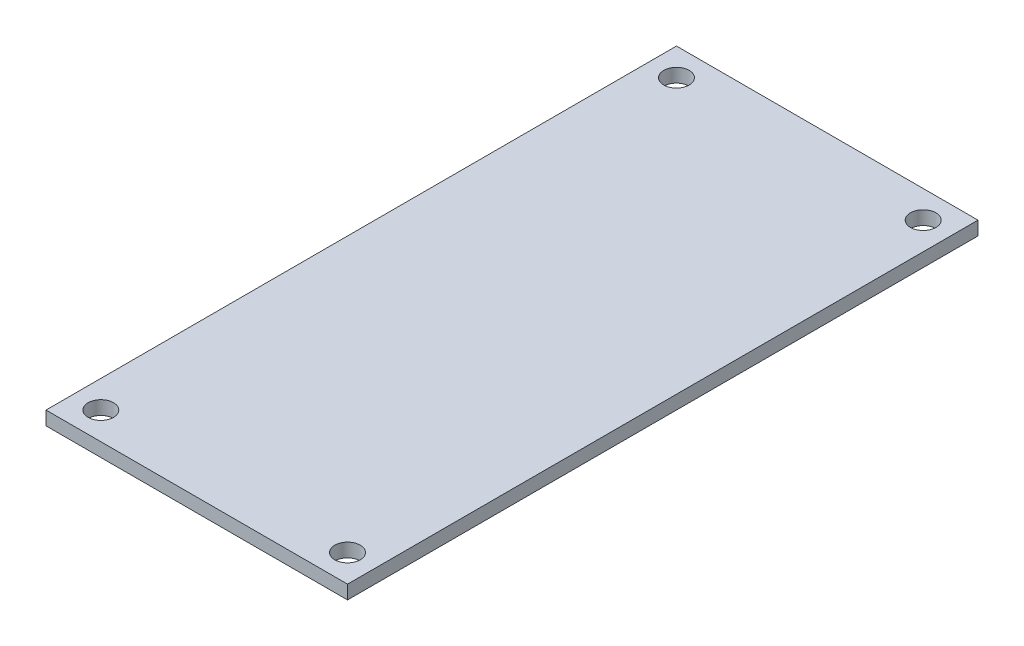
ISO-10303-21;
HEADER;
FILE_DESCRIPTION(('STEP AP214'),'2;1');
FILE_NAME('part.step','',(''),(''),'','','');
FILE_SCHEMA(('AUTOMOTIVE_DESIGN { 1 0 10303 214 1 1 1 1 }'));
ENDSEC;
DATA;
#1=APPLICATION_CONTEXT('core data for automotive mechanical design processes');
#2=APPLICATION_PROTOCOL_DEFINITION('international standard','automotive_design',2000,#1);
#3=PRODUCT_CONTEXT('',#1,'mechanical');
#4=PRODUCT('Part','Part','',(#3));
#5=PRODUCT_RELATED_PRODUCT_CATEGORY('part','',(#4));
#6=PRODUCT_DEFINITION_FORMATION('','',#4);
#7=PRODUCT_DEFINITION_CONTEXT('part definition',#1,'design');
#8=PRODUCT_DEFINITION('design','',#6,#7);
#9=PRODUCT_DEFINITION_SHAPE('','',#8);
#10=(LENGTH_UNIT() NAMED_UNIT(*) SI_UNIT(.MILLI.,.METRE.));
#11=(NAMED_UNIT(*) PLANE_ANGLE_UNIT() SI_UNIT($,.RADIAN.));
#12=(NAMED_UNIT(*) SI_UNIT($,.STERADIAN.) SOLID_ANGLE_UNIT());
#13=UNCERTAINTY_MEASURE_WITH_UNIT(LENGTH_MEASURE(1.E-05),#10,'distance_accuracy_value','');
#14=(GEOMETRIC_REPRESENTATION_CONTEXT(3) GLOBAL_UNCERTAINTY_ASSIGNED_CONTEXT((#13)) GLOBAL_UNIT_ASSIGNED_CONTEXT((#10,
#11,#12)) REPRESENTATION_CONTEXT('',''));
#15=CARTESIAN_POINT('',(0.,0.,0.));
#16=DIRECTION('',(0.,0.,1.));
#17=DIRECTION('',(1.,0.,0.));
#18=AXIS2_PLACEMENT_3D('',#15,#16,#17);
#19=CARTESIAN_POINT('',(0.,1.5875,0.));
#20=DIRECTION('',(0.,0.,-1.));
#21=DIRECTION('',(-1.,0.,0.));
#22=AXIS2_PLACEMENT_3D('',#19,#20,#21);
#23=PLANE('',#22);
#24=DIRECTION('',(1.,0.,0.));
#25=VECTOR('',#24,1.);
#26=CARTESIAN_POINT('',(0.,0.,0.));
#27=LINE('',#26,#25);
#28=CARTESIAN_POINT('',(0.,0.,0.));
#29=VERTEX_POINT('',#28);
#30=CARTESIAN_POINT('',(34.925,0.,0.));
#31=VERTEX_POINT('',#30);
#32=EDGE_CURVE('E96',#29,#31,#27,.T.);
#33=ORIENTED_EDGE('',*,*,#32,.T.);
#34=DIRECTION('',(0.,-1.,0.));
#35=VECTOR('',#34,1.);
#36=CARTESIAN_POINT('',(34.925,1.5875,0.));
#37=LINE('',#36,#35);
#38=CARTESIAN_POINT('',(34.925,1.5875,0.));
#39=VERTEX_POINT('',#38);
#40=EDGE_CURVE('E11',#39,#31,#37,.T.);
#41=ORIENTED_EDGE('',*,*,#40,.F.);
#42=DIRECTION('',(1.,0.,0.));
#43=VECTOR('',#42,1.);
#44=CARTESIAN_POINT('',(0.,1.5875,0.));
#45=LINE('',#44,#43);
#46=CARTESIAN_POINT('',(0.,1.5875,0.));
#47=VERTEX_POINT('',#46);
#48=EDGE_CURVE('E82',#47,#39,#45,.T.);
#49=ORIENTED_EDGE('',*,*,#48,.F.);
#50=DIRECTION('',(0.,-1.,0.));
#51=VECTOR('',#50,1.);
#52=CARTESIAN_POINT('',(0.,1.5875,0.));
#53=LINE('',#52,#51);
#54=EDGE_CURVE('E49',#47,#29,#53,.T.);
#55=ORIENTED_EDGE('',*,*,#54,.T.);
#56=EDGE_LOOP('',(#33,#41,#49,#55));
#57=FACE_BOUND('',#56,.T.);
#58=ADVANCED_FACE('F33',(#57),#23,.F.);
#59=CARTESIAN_POINT('',(34.925,1.5875,0.));
#60=DIRECTION('',(-1.,0.,0.));
#61=DIRECTION('',(0.,0.,1.));
#62=AXIS2_PLACEMENT_3D('',#59,#60,#61);
#63=PLANE('',#62);
#64=DIRECTION('',(0.,0.,-1.));
#65=VECTOR('',#64,1.);
#66=CARTESIAN_POINT('',(34.925,0.,0.));
#67=LINE('',#66,#65);
#68=CARTESIAN_POINT('',(34.925,0.,-73.025));
#69=VERTEX_POINT('',#68);
#70=EDGE_CURVE('E87',#31,#69,#67,.T.);
#71=ORIENTED_EDGE('',*,*,#70,.T.);
#72=DIRECTION('',(0.,-1.,0.));
#73=VECTOR('',#72,1.);
#74=CARTESIAN_POINT('',(34.925,1.5875,-73.025));
#75=LINE('',#74,#73);
#76=CARTESIAN_POINT('',(34.925,1.5875,-73.025));
#77=VERTEX_POINT('',#76);
#78=EDGE_CURVE('E41',#77,#69,#75,.T.);
#79=ORIENTED_EDGE('',*,*,#78,.F.);
#80=DIRECTION('',(0.,0.,-1.));
#81=VECTOR('',#80,1.);
#82=CARTESIAN_POINT('',(34.925,1.5875,0.));
#83=LINE('',#82,#81);
#84=EDGE_CURVE('E74',#39,#77,#83,.T.);
#85=ORIENTED_EDGE('',*,*,#84,.F.);
#86=ORIENTED_EDGE('',*,*,#40,.T.);
#87=EDGE_LOOP('',(#71,#79,#85,#86));
#88=FACE_BOUND('',#87,.T.);
#89=ADVANCED_FACE('F86',(#88),#63,.F.);
#90=CARTESIAN_POINT('',(0.,1.5875,-73.025));
#91=DIRECTION('',(0.,0.,-1.));
#92=DIRECTION('',(-1.,0.,0.));
#93=AXIS2_PLACEMENT_3D('',#90,#91,#92);
#94=PLANE('',#93);
#95=DIRECTION('',(1.,0.,0.));
#96=VECTOR('',#95,1.);
#97=CARTESIAN_POINT('',(0.,0.,-73.025));
#98=LINE('',#97,#96);
#99=CARTESIAN_POINT('',(0.,0.,-73.025));
#100=VERTEX_POINT('',#99);
#101=EDGE_CURVE('E100',#100,#69,#98,.T.);
#102=ORIENTED_EDGE('',*,*,#101,.F.);
#103=DIRECTION('',(0.,-1.,0.));
#104=VECTOR('',#103,1.);
#105=CARTESIAN_POINT('',(0.,1.5875,-73.025));
#106=LINE('',#105,#104);
#107=CARTESIAN_POINT('',(0.,1.5875,-73.025));
#108=VERTEX_POINT('',#107);
#109=EDGE_CURVE('E63',#108,#100,#106,.T.);
#110=ORIENTED_EDGE('',*,*,#109,.F.);
#111=DIRECTION('',(1.,0.,0.));
#112=VECTOR('',#111,1.);
#113=CARTESIAN_POINT('',(0.,1.5875,-73.025));
#114=LINE('',#113,#112);
#115=EDGE_CURVE('E81',#108,#77,#114,.T.);
#116=ORIENTED_EDGE('',*,*,#115,.T.);
#117=ORIENTED_EDGE('',*,*,#78,.T.);
#118=EDGE_LOOP('',(#102,#110,#116,#117));
#119=FACE_BOUND('',#118,.T.);
#120=ADVANCED_FACE('F90',(#119),#94,.T.);
#121=CARTESIAN_POINT('',(0.,1.5875,0.));
#122=DIRECTION('',(-1.,0.,0.));
#123=DIRECTION('',(0.,0.,1.));
#124=AXIS2_PLACEMENT_3D('',#121,#122,#123);
#125=PLANE('',#124);
#126=DIRECTION('',(0.,0.,-1.));
#127=VECTOR('',#126,1.);
#128=CARTESIAN_POINT('',(0.,0.,0.));
#129=LINE('',#128,#127);
#130=EDGE_CURVE('E102',#29,#100,#129,.T.);
#131=ORIENTED_EDGE('',*,*,#130,.F.);
#132=ORIENTED_EDGE('',*,*,#54,.F.);
#133=DIRECTION('',(0.,0.,-1.));
#134=VECTOR('',#133,1.);
#135=CARTESIAN_POINT('',(0.,1.5875,0.));
#136=LINE('',#135,#134);
#137=EDGE_CURVE('E91',#47,#108,#136,.T.);
#138=ORIENTED_EDGE('',*,*,#137,.T.);
#139=ORIENTED_EDGE('',*,*,#109,.T.);
#140=EDGE_LOOP('',(#131,#132,#138,#139));
#141=FACE_BOUND('',#140,.T.);
#142=ADVANCED_FACE('F138',(#141),#125,.T.);
#143=CARTESIAN_POINT('',(0.,1.5875,0.));
#144=DIRECTION('',(0.,1.,0.));
#145=DIRECTION('',(0.,0.,1.));
#146=AXIS2_PLACEMENT_3D('',#143,#144,#145);
#147=PLANE('',#146);
#148=CARTESIAN_POINT('',(3.17500000000001,1.5875,-3.175));
#149=DIRECTION('',(0.,1.,0.));
#150=DIRECTION('',(0.,0.,1.));
#151=AXIS2_PLACEMENT_3D('',#148,#149,#150);
#152=CIRCLE('',#151,1.4732);
#153=CARTESIAN_POINT('',(3.17500000000001,1.5875,-1.7018));
#154=VERTEX_POINT('',#153);
#155=EDGE_CURVE('E123',#154,#154,#152,.T.);
#156=ORIENTED_EDGE('',*,*,#155,.F.);
#157=EDGE_LOOP('',(#156));
#158=FACE_BOUND('',#157,.T.);
#159=CARTESIAN_POINT('',(31.75,1.5875,-3.175));
#160=DIRECTION('',(0.,1.,0.));
#161=DIRECTION('',(0.,0.,1.));
#162=AXIS2_PLACEMENT_3D('',#159,#160,#161);
#163=CIRCLE('',#162,1.4732);
#164=CARTESIAN_POINT('',(31.75,1.5875,-1.7018));
#165=VERTEX_POINT('',#164);
#166=EDGE_CURVE('E117',#165,#165,#163,.T.);
#167=ORIENTED_EDGE('',*,*,#166,.F.);
#168=EDGE_LOOP('',(#167));
#169=FACE_BOUND('',#168,.T.);
#170=CARTESIAN_POINT('',(3.175,1.5875,-69.85));
#171=DIRECTION('',(0.,1.,0.));
#172=DIRECTION('',(0.,0.,1.));
#173=AXIS2_PLACEMENT_3D('',#170,#171,#172);
#174=CIRCLE('',#173,1.4732);
#175=CARTESIAN_POINT('',(3.175,1.5875,-68.3768));
#176=VERTEX_POINT('',#175);
#177=EDGE_CURVE('E111',#176,#176,#174,.T.);
#178=ORIENTED_EDGE('',*,*,#177,.F.);
#179=EDGE_LOOP('',(#178));
#180=FACE_BOUND('',#179,.T.);
#181=CARTESIAN_POINT('',(31.75,1.5875,-69.85));
#182=DIRECTION('',(0.,1.,0.));
#183=DIRECTION('',(0.,0.,1.));
#184=AXIS2_PLACEMENT_3D('',#181,#182,#183);
#185=CIRCLE('',#184,1.4732);
#186=CARTESIAN_POINT('',(31.75,1.5875,-68.3768));
#187=VERTEX_POINT('',#186);
#188=EDGE_CURVE('E98',#187,#187,#185,.T.);
#189=ORIENTED_EDGE('',*,*,#188,.F.);
#190=EDGE_LOOP('',(#189));
#191=FACE_BOUND('',#190,.T.);
#192=ORIENTED_EDGE('',*,*,#48,.T.);
#193=ORIENTED_EDGE('',*,*,#84,.T.);
#194=ORIENTED_EDGE('',*,*,#115,.F.);
#195=ORIENTED_EDGE('',*,*,#137,.F.);
#196=EDGE_LOOP('',(#192,#193,#194,#195));
#197=FACE_BOUND('',#196,.T.);
#198=ADVANCED_FACE('F78',(#158,#169,#180,#191,#197),#147,.T.);
#199=CARTESIAN_POINT('',(0.,0.,0.));
#200=DIRECTION('',(0.,1.,0.));
#201=DIRECTION('',(0.,0.,1.));
#202=AXIS2_PLACEMENT_3D('',#199,#200,#201);
#203=PLANE('',#202);
#204=CARTESIAN_POINT('',(3.17500000000001,0.,-3.175));
#205=DIRECTION('',(0.,1.,0.));
#206=DIRECTION('',(0.,0.,1.));
#207=AXIS2_PLACEMENT_3D('',#204,#205,#206);
#208=CIRCLE('',#207,1.4732);
#209=CARTESIAN_POINT('',(3.17500000000001,0.,-1.7018));
#210=VERTEX_POINT('',#209);
#211=EDGE_CURVE('E126',#210,#210,#208,.T.);
#212=ORIENTED_EDGE('',*,*,#211,.T.);
#213=EDGE_LOOP('',(#212));
#214=FACE_BOUND('',#213,.T.);
#215=CARTESIAN_POINT('',(31.75,0.,-3.175));
#216=DIRECTION('',(0.,1.,0.));
#217=DIRECTION('',(0.,0.,1.));
#218=AXIS2_PLACEMENT_3D('',#215,#216,#217);
#219=CIRCLE('',#218,1.4732);
#220=CARTESIAN_POINT('',(31.75,0.,-1.7018));
#221=VERTEX_POINT('',#220);
#222=EDGE_CURVE('E120',#221,#221,#219,.T.);
#223=ORIENTED_EDGE('',*,*,#222,.T.);
#224=EDGE_LOOP('',(#223));
#225=FACE_BOUND('',#224,.T.);
#226=CARTESIAN_POINT('',(3.175,0.,-69.85));
#227=DIRECTION('',(0.,1.,0.));
#228=DIRECTION('',(0.,0.,1.));
#229=AXIS2_PLACEMENT_3D('',#226,#227,#228);
#230=CIRCLE('',#229,1.4732);
#231=CARTESIAN_POINT('',(3.175,0.,-68.3768));
#232=VERTEX_POINT('',#231);
#233=EDGE_CURVE('E114',#232,#232,#230,.T.);
#234=ORIENTED_EDGE('',*,*,#233,.T.);
#235=EDGE_LOOP('',(#234));
#236=FACE_BOUND('',#235,.T.);
#237=CARTESIAN_POINT('',(31.75,0.,-69.85));
#238=DIRECTION('',(0.,1.,0.));
#239=DIRECTION('',(0.,0.,1.));
#240=AXIS2_PLACEMENT_3D('',#237,#238,#239);
#241=CIRCLE('',#240,1.4732);
#242=CARTESIAN_POINT('',(31.75,0.,-68.3768));
#243=VERTEX_POINT('',#242);
#244=EDGE_CURVE('E108',#243,#243,#241,.T.);
#245=ORIENTED_EDGE('',*,*,#244,.T.);
#246=EDGE_LOOP('',(#245));
#247=FACE_BOUND('',#246,.T.);
#248=ORIENTED_EDGE('',*,*,#32,.F.);
#249=ORIENTED_EDGE('',*,*,#130,.T.);
#250=ORIENTED_EDGE('',*,*,#101,.T.);
#251=ORIENTED_EDGE('',*,*,#70,.F.);
#252=EDGE_LOOP('',(#248,#249,#250,#251));
#253=FACE_BOUND('',#252,.T.);
#254=ADVANCED_FACE('F137',(#214,#225,#236,#247,#253),#203,.F.);
#255=CARTESIAN_POINT('',(31.75,1.5875,-69.85));
#256=DIRECTION('',(0.,-1.,0.));
#257=DIRECTION('',(0.,0.,-1.));
#258=AXIS2_PLACEMENT_3D('',#255,#256,#257);
#259=CYLINDRICAL_SURFACE('',#258,1.4732);
#260=ORIENTED_EDGE('',*,*,#188,.T.);
#261=EDGE_LOOP('',(#260));
#262=FACE_BOUND('',#261,.T.);
#263=ORIENTED_EDGE('',*,*,#244,.F.);
#264=EDGE_LOOP('',(#263));
#265=FACE_BOUND('',#264,.T.);
#266=ADVANCED_FACE('F146',(#262,#265),#259,.F.);
#267=CARTESIAN_POINT('',(3.175,1.5875,-69.85));
#268=DIRECTION('',(0.,-1.,0.));
#269=DIRECTION('',(0.,0.,-1.));
#270=AXIS2_PLACEMENT_3D('',#267,#268,#269);
#271=CYLINDRICAL_SURFACE('',#270,1.4732);
#272=ORIENTED_EDGE('',*,*,#177,.T.);
#273=EDGE_LOOP('',(#272));
#274=FACE_BOUND('',#273,.T.);
#275=ORIENTED_EDGE('',*,*,#233,.F.);
#276=EDGE_LOOP('',(#275));
#277=FACE_BOUND('',#276,.T.);
#278=ADVANCED_FACE('F149',(#274,#277),#271,.F.);
#279=CARTESIAN_POINT('',(31.75,1.5875,-3.175));
#280=DIRECTION('',(0.,-1.,0.));
#281=DIRECTION('',(0.,0.,-1.));
#282=AXIS2_PLACEMENT_3D('',#279,#280,#281);
#283=CYLINDRICAL_SURFACE('',#282,1.4732);
#284=ORIENTED_EDGE('',*,*,#166,.T.);
#285=EDGE_LOOP('',(#284));
#286=FACE_BOUND('',#285,.T.);
#287=ORIENTED_EDGE('',*,*,#222,.F.);
#288=EDGE_LOOP('',(#287));
#289=FACE_BOUND('',#288,.T.);
#290=ADVANCED_FACE('F203',(#286,#289),#283,.F.);
#291=CARTESIAN_POINT('',(3.17500000000001,1.5875,-3.175));
#292=DIRECTION('',(0.,-1.,0.));
#293=DIRECTION('',(0.,0.,-1.));
#294=AXIS2_PLACEMENT_3D('',#291,#292,#293);
#295=CYLINDRICAL_SURFACE('',#294,1.4732);
#296=ORIENTED_EDGE('',*,*,#155,.T.);
#297=EDGE_LOOP('',(#296));
#298=FACE_BOUND('',#297,.T.);
#299=ORIENTED_EDGE('',*,*,#211,.F.);
#300=EDGE_LOOP('',(#299));
#301=FACE_BOUND('',#300,.T.);
#302=ADVANCED_FACE('F132',(#298,#301),#295,.F.);
#303=CLOSED_SHELL('',(#58,#89,#120,#142,#198,#254,#266,#278,#290,#302));
#304=MANIFOLD_SOLID_BREP('B2',#303);
#305=ADVANCED_BREP_SHAPE_REPRESENTATION('',(#18,#304),#14);
#306=SHAPE_DEFINITION_REPRESENTATION(#9,#305);
ENDSEC;
END-ISO-10303-21;
